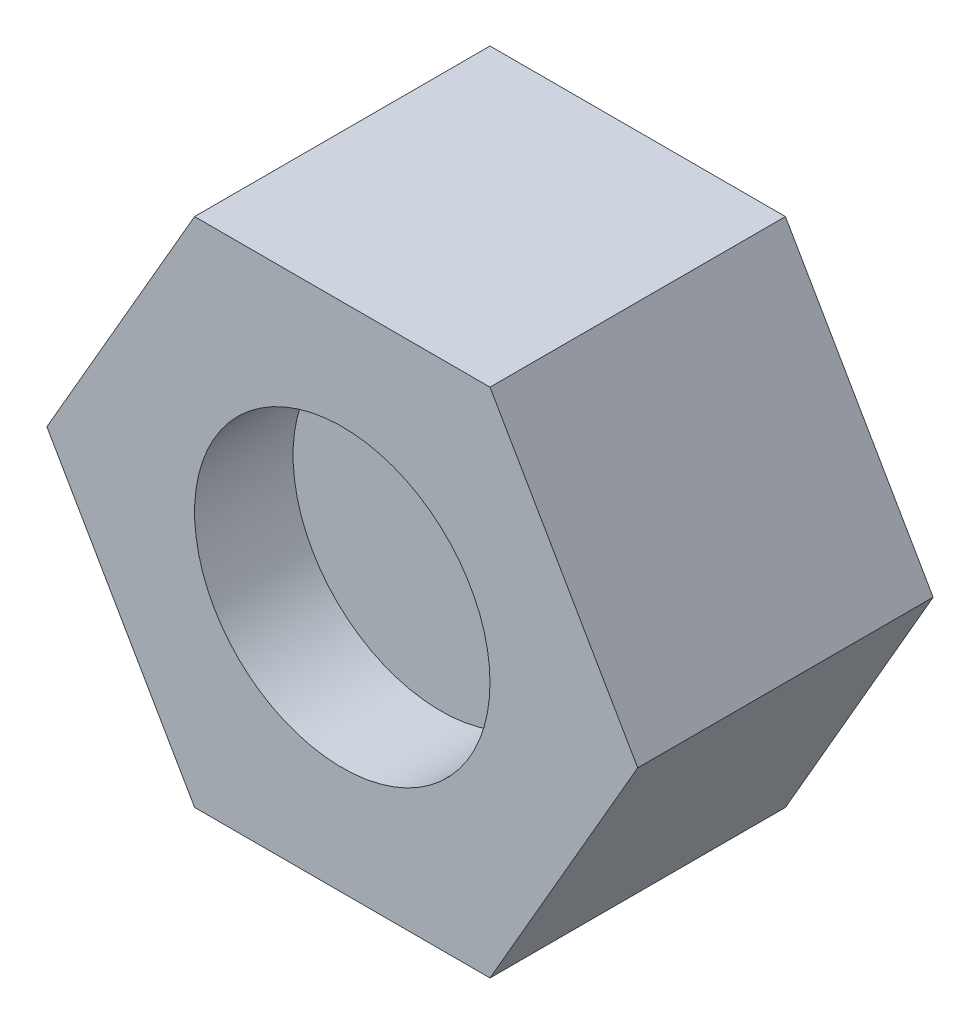
ISO-10303-21;
HEADER;
FILE_DESCRIPTION(('STEP AP214'),'2;1');
FILE_NAME('part.step','',(''),(''),'','','');
FILE_SCHEMA(('AUTOMOTIVE_DESIGN { 1 0 10303 214 1 1 1 1 }'));
ENDSEC;
DATA;
#1=APPLICATION_CONTEXT('core data for automotive mechanical design processes');
#2=APPLICATION_PROTOCOL_DEFINITION('international standard','automotive_design',2000,#1);
#3=PRODUCT_CONTEXT('',#1,'mechanical');
#4=PRODUCT('Part','Part','',(#3));
#5=PRODUCT_RELATED_PRODUCT_CATEGORY('part','',(#4));
#6=PRODUCT_DEFINITION_FORMATION('','',#4);
#7=PRODUCT_DEFINITION_CONTEXT('part definition',#1,'design');
#8=PRODUCT_DEFINITION('design','',#6,#7);
#9=PRODUCT_DEFINITION_SHAPE('','',#8);
#10=(LENGTH_UNIT() NAMED_UNIT(*) SI_UNIT(.MILLI.,.METRE.));
#11=(NAMED_UNIT(*) PLANE_ANGLE_UNIT() SI_UNIT($,.RADIAN.));
#12=(NAMED_UNIT(*) SI_UNIT($,.STERADIAN.) SOLID_ANGLE_UNIT());
#13=UNCERTAINTY_MEASURE_WITH_UNIT(LENGTH_MEASURE(1.E-05),#10,'distance_accuracy_value','');
#14=(GEOMETRIC_REPRESENTATION_CONTEXT(3) GLOBAL_UNCERTAINTY_ASSIGNED_CONTEXT((#13)) GLOBAL_UNIT_ASSIGNED_CONTEXT((#10,
#11,#12)) REPRESENTATION_CONTEXT('',''));
#15=CARTESIAN_POINT('',(0.,0.,0.));
#16=DIRECTION('',(0.,0.,1.));
#17=DIRECTION('',(1.,0.,0.));
#18=AXIS2_PLACEMENT_3D('',#15,#16,#17);
#19=CARTESIAN_POINT('',(-7.49999999999999,-12.9903810567666,15.));
#20=DIRECTION('',(0.,1.,0.));
#21=DIRECTION('',(-1.,0.,0.));
#22=AXIS2_PLACEMENT_3D('',#19,#20,#21);
#23=PLANE('',#22);
#24=DIRECTION('',(1.,0.,0.));
#25=VECTOR('',#24,1.);
#26=CARTESIAN_POINT('',(-7.49999999999999,-12.9903810567666,0.));
#27=LINE('',#26,#25);
#28=CARTESIAN_POINT('',(-7.49999999999999,-12.9903810567666,0.));
#29=VERTEX_POINT('',#28);
#30=CARTESIAN_POINT('',(7.49999999999999,-12.9903810567666,0.));
#31=VERTEX_POINT('',#30);
#32=EDGE_CURVE('E124',#29,#31,#27,.T.);
#33=ORIENTED_EDGE('',*,*,#32,.T.);
#34=DIRECTION('',(0.,0.,-1.));
#35=VECTOR('',#34,1.);
#36=CARTESIAN_POINT('',(7.49999999999999,-12.9903810567666,15.));
#37=LINE('',#36,#35);
#38=CARTESIAN_POINT('',(7.49999999999999,-12.9903810567666,15.));
#39=VERTEX_POINT('',#38);
#40=EDGE_CURVE('E11',#39,#31,#37,.T.);
#41=ORIENTED_EDGE('',*,*,#40,.F.);
#42=DIRECTION('',(1.,0.,0.));
#43=VECTOR('',#42,1.);
#44=CARTESIAN_POINT('',(-7.49999999999999,-12.9903810567666,15.));
#45=LINE('',#44,#43);
#46=CARTESIAN_POINT('',(-7.49999999999999,-12.9903810567666,15.));
#47=VERTEX_POINT('',#46);
#48=EDGE_CURVE('E135',#47,#39,#45,.T.);
#49=ORIENTED_EDGE('',*,*,#48,.F.);
#50=DIRECTION('',(0.,0.,-1.));
#51=VECTOR('',#50,1.);
#52=CARTESIAN_POINT('',(-7.49999999999999,-12.9903810567666,15.));
#53=LINE('',#52,#51);
#54=EDGE_CURVE('E120',#47,#29,#53,.T.);
#55=ORIENTED_EDGE('',*,*,#54,.T.);
#56=EDGE_LOOP('',(#33,#41,#49,#55));
#57=FACE_BOUND('',#56,.T.);
#58=ADVANCED_FACE('F40',(#57),#23,.F.);
#59=CARTESIAN_POINT('',(7.49999999999999,-12.9903810567666,15.));
#60=DIRECTION('',(-0.866025403784439,0.5,0.));
#61=DIRECTION('',(-0.5,-0.866025403784439,0.));
#62=AXIS2_PLACEMENT_3D('',#59,#60,#61);
#63=PLANE('',#62);
#64=DIRECTION('',(0.5,0.866025403784439,0.));
#65=VECTOR('',#64,1.);
#66=CARTESIAN_POINT('',(7.49999999999999,-12.9903810567666,0.));
#67=LINE('',#66,#65);
#68=CARTESIAN_POINT('',(15.,0.,0.));
#69=VERTEX_POINT('',#68);
#70=EDGE_CURVE('E127',#31,#69,#67,.T.);
#71=ORIENTED_EDGE('',*,*,#70,.T.);
#72=DIRECTION('',(0.,0.,-1.));
#73=VECTOR('',#72,1.);
#74=CARTESIAN_POINT('',(15.,0.,15.));
#75=LINE('',#74,#73);
#76=CARTESIAN_POINT('',(15.,0.,15.));
#77=VERTEX_POINT('',#76);
#78=EDGE_CURVE('E48',#77,#69,#75,.T.);
#79=ORIENTED_EDGE('',*,*,#78,.F.);
#80=DIRECTION('',(0.5,0.866025403784439,0.));
#81=VECTOR('',#80,1.);
#82=CARTESIAN_POINT('',(7.49999999999999,-12.9903810567666,15.));
#83=LINE('',#82,#81);
#84=EDGE_CURVE('E93',#39,#77,#83,.T.);
#85=ORIENTED_EDGE('',*,*,#84,.F.);
#86=ORIENTED_EDGE('',*,*,#40,.T.);
#87=EDGE_LOOP('',(#71,#79,#85,#86));
#88=FACE_BOUND('',#87,.T.);
#89=ADVANCED_FACE('F160',(#88),#63,.F.);
#90=CARTESIAN_POINT('',(15.,0.,15.));
#91=DIRECTION('',(-0.866025403784439,-0.5,0.));
#92=DIRECTION('',(0.5,-0.866025403784439,0.));
#93=AXIS2_PLACEMENT_3D('',#90,#91,#92);
#94=PLANE('',#93);
#95=DIRECTION('',(-0.5,0.866025403784439,0.));
#96=VECTOR('',#95,1.);
#97=CARTESIAN_POINT('',(15.,0.,0.));
#98=LINE('',#97,#96);
#99=CARTESIAN_POINT('',(7.5,12.9903810567666,0.));
#100=VERTEX_POINT('',#99);
#101=EDGE_CURVE('E130',#69,#100,#98,.T.);
#102=ORIENTED_EDGE('',*,*,#101,.T.);
#103=DIRECTION('',(0.,0.,-1.));
#104=VECTOR('',#103,1.);
#105=CARTESIAN_POINT('',(7.5,12.9903810567666,15.));
#106=LINE('',#105,#104);
#107=CARTESIAN_POINT('',(7.5,12.9903810567666,15.));
#108=VERTEX_POINT('',#107);
#109=EDGE_CURVE('E115',#108,#100,#106,.T.);
#110=ORIENTED_EDGE('',*,*,#109,.F.);
#111=DIRECTION('',(-0.5,0.866025403784439,0.));
#112=VECTOR('',#111,1.);
#113=CARTESIAN_POINT('',(15.,0.,15.));
#114=LINE('',#113,#112);
#115=EDGE_CURVE('E106',#77,#108,#114,.T.);
#116=ORIENTED_EDGE('',*,*,#115,.F.);
#117=ORIENTED_EDGE('',*,*,#78,.T.);
#118=EDGE_LOOP('',(#102,#110,#116,#117));
#119=FACE_BOUND('',#118,.T.);
#120=ADVANCED_FACE('F141',(#119),#94,.F.);
#121=CARTESIAN_POINT('',(7.5,12.9903810567666,15.));
#122=DIRECTION('',(0.,-1.,0.));
#123=DIRECTION('',(1.,0.,0.));
#124=AXIS2_PLACEMENT_3D('',#121,#122,#123);
#125=PLANE('',#124);
#126=DIRECTION('',(-1.,0.,0.));
#127=VECTOR('',#126,1.);
#128=CARTESIAN_POINT('',(7.5,12.9903810567666,0.));
#129=LINE('',#128,#127);
#130=CARTESIAN_POINT('',(-7.5,12.9903810567666,0.));
#131=VERTEX_POINT('',#130);
#132=EDGE_CURVE('E114',#100,#131,#129,.T.);
#133=ORIENTED_EDGE('',*,*,#132,.T.);
#134=DIRECTION('',(0.,0.,-1.));
#135=VECTOR('',#134,1.);
#136=CARTESIAN_POINT('',(-7.5,12.9903810567666,15.));
#137=LINE('',#136,#135);
#138=CARTESIAN_POINT('',(-7.5,12.9903810567666,15.));
#139=VERTEX_POINT('',#138);
#140=EDGE_CURVE('E111',#139,#131,#137,.T.);
#141=ORIENTED_EDGE('',*,*,#140,.F.);
#142=DIRECTION('',(-1.,0.,0.));
#143=VECTOR('',#142,1.);
#144=CARTESIAN_POINT('',(7.5,12.9903810567666,15.));
#145=LINE('',#144,#143);
#146=EDGE_CURVE('E100',#108,#139,#145,.T.);
#147=ORIENTED_EDGE('',*,*,#146,.F.);
#148=ORIENTED_EDGE('',*,*,#109,.T.);
#149=EDGE_LOOP('',(#133,#141,#147,#148));
#150=FACE_BOUND('',#149,.T.);
#151=ADVANCED_FACE('F112',(#150),#125,.F.);
#152=CARTESIAN_POINT('',(-7.5,12.9903810567666,15.));
#153=DIRECTION('',(0.866025403784438,-0.5,0.));
#154=DIRECTION('',(0.5,0.866025403784439,0.));
#155=AXIS2_PLACEMENT_3D('',#152,#153,#154);
#156=PLANE('',#155);
#157=DIRECTION('',(-0.5,-0.866025403784439,0.));
#158=VECTOR('',#157,1.);
#159=CARTESIAN_POINT('',(-7.5,12.9903810567666,0.));
#160=LINE('',#159,#158);
#161=CARTESIAN_POINT('',(-15.,0.,0.));
#162=VERTEX_POINT('',#161);
#163=EDGE_CURVE('E79',#131,#162,#160,.T.);
#164=ORIENTED_EDGE('',*,*,#163,.T.);
#165=DIRECTION('',(0.,0.,-1.));
#166=VECTOR('',#165,1.);
#167=CARTESIAN_POINT('',(-15.,0.,15.));
#168=LINE('',#167,#166);
#169=CARTESIAN_POINT('',(-15.,0.,15.));
#170=VERTEX_POINT('',#169);
#171=EDGE_CURVE('E116',#170,#162,#168,.T.);
#172=ORIENTED_EDGE('',*,*,#171,.F.);
#173=DIRECTION('',(-0.5,-0.866025403784439,0.));
#174=VECTOR('',#173,1.);
#175=CARTESIAN_POINT('',(-7.5,12.9903810567666,15.));
#176=LINE('',#175,#174);
#177=EDGE_CURVE('E104',#139,#170,#176,.T.);
#178=ORIENTED_EDGE('',*,*,#177,.F.);
#179=ORIENTED_EDGE('',*,*,#140,.T.);
#180=EDGE_LOOP('',(#164,#172,#178,#179));
#181=FACE_BOUND('',#180,.T.);
#182=ADVANCED_FACE('F118',(#181),#156,.F.);
#183=CARTESIAN_POINT('',(-15.,0.,15.));
#184=DIRECTION('',(0.866025403784439,0.5,0.));
#185=DIRECTION('',(-0.5,0.866025403784439,0.));
#186=AXIS2_PLACEMENT_3D('',#183,#184,#185);
#187=PLANE('',#186);
#188=DIRECTION('',(0.5,-0.866025403784439,0.));
#189=VECTOR('',#188,1.);
#190=CARTESIAN_POINT('',(-15.,0.,0.));
#191=LINE('',#190,#189);
#192=EDGE_CURVE('E85',#162,#29,#191,.T.);
#193=ORIENTED_EDGE('',*,*,#192,.T.);
#194=ORIENTED_EDGE('',*,*,#54,.F.);
#195=DIRECTION('',(0.5,-0.866025403784439,0.));
#196=VECTOR('',#195,1.);
#197=CARTESIAN_POINT('',(-15.,0.,15.));
#198=LINE('',#197,#196);
#199=EDGE_CURVE('E56',#170,#47,#198,.T.);
#200=ORIENTED_EDGE('',*,*,#199,.F.);
#201=ORIENTED_EDGE('',*,*,#171,.T.);
#202=EDGE_LOOP('',(#193,#194,#200,#201));
#203=FACE_BOUND('',#202,.T.);
#204=ADVANCED_FACE('F148',(#203),#187,.F.);
#205=CARTESIAN_POINT('',(0.,0.,15.));
#206=DIRECTION('',(0.,0.,1.));
#207=DIRECTION('',(1.,0.,0.));
#208=AXIS2_PLACEMENT_3D('',#205,#206,#207);
#209=PLANE('',#208);
#210=CARTESIAN_POINT('',(0.,0.,15.));
#211=DIRECTION('',(0.,0.,1.));
#212=DIRECTION('',(1.,0.,0.));
#213=AXIS2_PLACEMENT_3D('',#210,#211,#212);
#214=CIRCLE('',#213,7.5);
#215=CARTESIAN_POINT('',(7.5,0.,15.));
#216=VERTEX_POINT('',#215);
#217=EDGE_CURVE('E226',#216,#216,#214,.T.);
#218=ORIENTED_EDGE('',*,*,#217,.F.);
#219=EDGE_LOOP('',(#218));
#220=FACE_BOUND('',#219,.T.);
#221=ORIENTED_EDGE('',*,*,#48,.T.);
#222=ORIENTED_EDGE('',*,*,#84,.T.);
#223=ORIENTED_EDGE('',*,*,#115,.T.);
#224=ORIENTED_EDGE('',*,*,#146,.T.);
#225=ORIENTED_EDGE('',*,*,#177,.T.);
#226=ORIENTED_EDGE('',*,*,#199,.T.);
#227=EDGE_LOOP('',(#221,#222,#223,#224,#225,#226));
#228=FACE_BOUND('',#227,.T.);
#229=ADVANCED_FACE('F102',(#220,#228),#209,.T.);
#230=CARTESIAN_POINT('',(0.,0.,0.));
#231=DIRECTION('',(0.,0.,1.));
#232=DIRECTION('',(1.,0.,0.));
#233=AXIS2_PLACEMENT_3D('',#230,#231,#232);
#234=PLANE('',#233);
#235=ORIENTED_EDGE('',*,*,#32,.F.);
#236=ORIENTED_EDGE('',*,*,#192,.F.);
#237=ORIENTED_EDGE('',*,*,#163,.F.);
#238=ORIENTED_EDGE('',*,*,#132,.F.);
#239=ORIENTED_EDGE('',*,*,#101,.F.);
#240=ORIENTED_EDGE('',*,*,#70,.F.);
#241=EDGE_LOOP('',(#235,#236,#237,#238,#239,#240));
#242=FACE_BOUND('',#241,.T.);
#243=ADVANCED_FACE('F144',(#242),#234,.F.);
#244=CARTESIAN_POINT('',(0.,0.,10.));
#245=DIRECTION('',(0.,0.,1.));
#246=DIRECTION('',(1.,0.,0.));
#247=AXIS2_PLACEMENT_3D('',#244,#245,#246);
#248=CYLINDRICAL_SURFACE('',#247,7.5);
#249=CARTESIAN_POINT('',(0.,0.,10.));
#250=DIRECTION('',(0.,0.,1.));
#251=DIRECTION('',(1.,0.,0.));
#252=AXIS2_PLACEMENT_3D('',#249,#250,#251);
#253=CIRCLE('',#252,7.5);
#254=CARTESIAN_POINT('',(7.5,0.,10.));
#255=VERTEX_POINT('',#254);
#256=EDGE_CURVE('E128',#255,#255,#253,.T.);
#257=ORIENTED_EDGE('',*,*,#256,.F.);
#258=EDGE_LOOP('',(#257));
#259=FACE_BOUND('',#258,.T.);
#260=ORIENTED_EDGE('',*,*,#217,.T.);
#261=EDGE_LOOP('',(#260));
#262=FACE_BOUND('',#261,.T.);
#263=ADVANCED_FACE('F192',(#259,#262),#248,.F.);
#264=CARTESIAN_POINT('',(0.,0.,10.));
#265=DIRECTION('',(0.,0.,1.));
#266=DIRECTION('',(1.,0.,0.));
#267=AXIS2_PLACEMENT_3D('',#264,#265,#266);
#268=PLANE('',#267);
#269=ORIENTED_EDGE('',*,*,#256,.T.);
#270=EDGE_LOOP('',(#269));
#271=FACE_BOUND('',#270,.T.);
#272=ADVANCED_FACE('F207',(#271),#268,.T.);
#273=CLOSED_SHELL('',(#58,#89,#120,#151,#182,#204,#229,#243,#263,#272));
#274=MANIFOLD_SOLID_BREP('B2',#273);
#275=ADVANCED_BREP_SHAPE_REPRESENTATION('',(#18,#274),#14);
#276=SHAPE_DEFINITION_REPRESENTATION(#9,#275);
ENDSEC;
END-ISO-10303-21;
